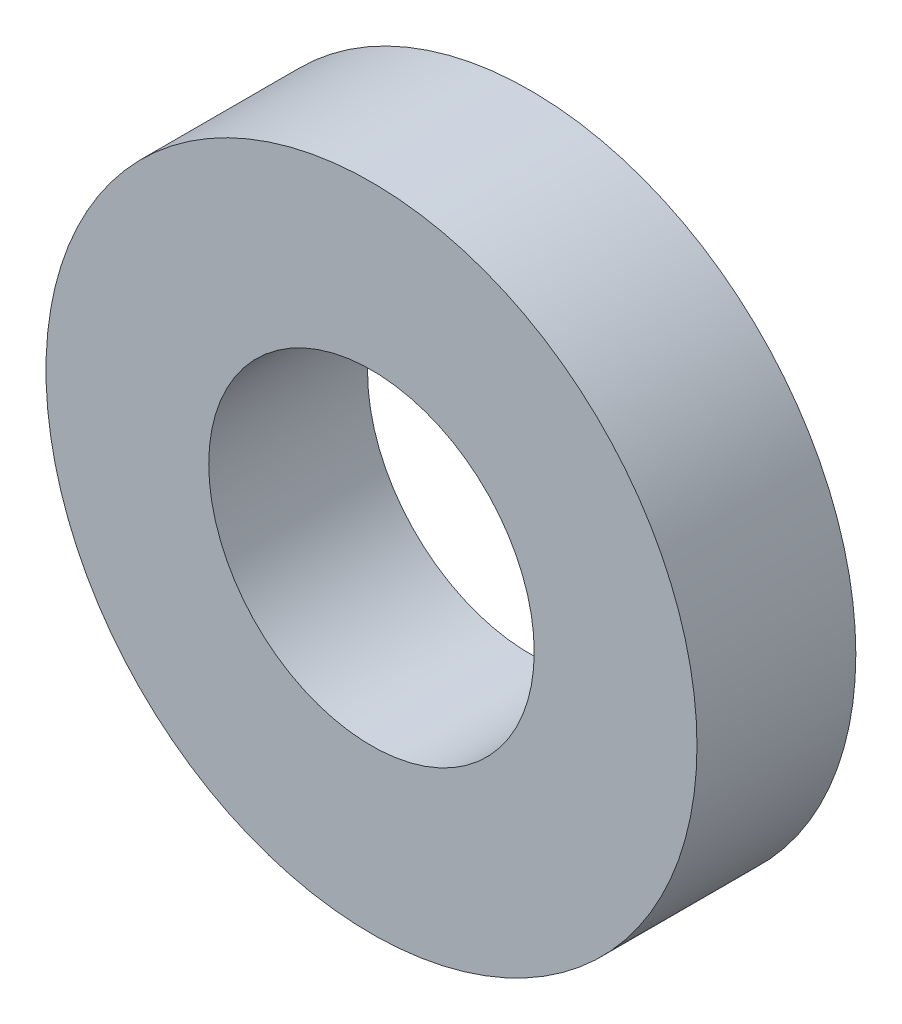
ISO-10303-21;
HEADER;
FILE_DESCRIPTION(('STEP AP214'),'2;1');
FILE_NAME('part.step','',(''),(''),'','','');
FILE_SCHEMA(('AUTOMOTIVE_DESIGN { 1 0 10303 214 1 1 1 1 }'));
ENDSEC;
DATA;
#1=APPLICATION_CONTEXT('core data for automotive mechanical design processes');
#2=APPLICATION_PROTOCOL_DEFINITION('international standard','automotive_design',2000,#1);
#3=PRODUCT_CONTEXT('',#1,'mechanical');
#4=PRODUCT('Part','Part','',(#3));
#5=PRODUCT_RELATED_PRODUCT_CATEGORY('part','',(#4));
#6=PRODUCT_DEFINITION_FORMATION('','',#4);
#7=PRODUCT_DEFINITION_CONTEXT('part definition',#1,'design');
#8=PRODUCT_DEFINITION('design','',#6,#7);
#9=PRODUCT_DEFINITION_SHAPE('','',#8);
#10=(LENGTH_UNIT() NAMED_UNIT(*) SI_UNIT(.MILLI.,.METRE.));
#11=(NAMED_UNIT(*) PLANE_ANGLE_UNIT() SI_UNIT($,.RADIAN.));
#12=(NAMED_UNIT(*) SI_UNIT($,.STERADIAN.) SOLID_ANGLE_UNIT());
#13=UNCERTAINTY_MEASURE_WITH_UNIT(LENGTH_MEASURE(1.E-05),#10,'distance_accuracy_value','');
#14=(GEOMETRIC_REPRESENTATION_CONTEXT(3) GLOBAL_UNCERTAINTY_ASSIGNED_CONTEXT((#13)) GLOBAL_UNIT_ASSIGNED_CONTEXT((#10,
#11,#12)) REPRESENTATION_CONTEXT('',''));
#15=CARTESIAN_POINT('',(0.,0.,0.));
#16=DIRECTION('',(0.,0.,1.));
#17=DIRECTION('',(1.,0.,0.));
#18=AXIS2_PLACEMENT_3D('',#15,#16,#17);
#19=CARTESIAN_POINT('',(0.,0.,3.0988));
#20=DIRECTION('',(0.,0.,1.));
#21=DIRECTION('',(1.,0.,0.));
#22=AXIS2_PLACEMENT_3D('',#19,#20,#21);
#23=PLANE('',#22);
#24=CARTESIAN_POINT('',(0.,0.,3.0988));
#25=DIRECTION('',(0.,0.,1.));
#26=DIRECTION('',(1.,0.,0.));
#27=AXIS2_PLACEMENT_3D('',#24,#25,#26);
#28=CIRCLE('',#27,6.35);
#29=CARTESIAN_POINT('',(6.35,0.,3.0988));
#30=VERTEX_POINT('',#29);
#31=EDGE_CURVE('E10',#30,#30,#28,.T.);
#32=ORIENTED_EDGE('',*,*,#31,.T.);
#33=EDGE_LOOP('',(#32));
#34=FACE_BOUND('',#33,.T.);
#35=CARTESIAN_POINT('',(0.,0.,3.0988));
#36=DIRECTION('',(0.,0.,1.));
#37=DIRECTION('',(1.,0.,0.));
#38=AXIS2_PLACEMENT_3D('',#35,#36,#37);
#39=CIRCLE('',#38,3.175);
#40=CARTESIAN_POINT('',(3.175,0.,3.0988));
#41=VERTEX_POINT('',#40);
#42=EDGE_CURVE('E44',#41,#41,#39,.T.);
#43=ORIENTED_EDGE('',*,*,#42,.F.);
#44=EDGE_LOOP('',(#43));
#45=FACE_BOUND('',#44,.T.);
#46=ADVANCED_FACE('F33',(#34,#45),#23,.T.);
#47=CARTESIAN_POINT('',(0.,0.,0.));
#48=DIRECTION('',(0.,0.,1.));
#49=DIRECTION('',(1.,0.,0.));
#50=AXIS2_PLACEMENT_3D('',#47,#48,#49);
#51=PLANE('',#50);
#52=CARTESIAN_POINT('',(0.,0.,0.));
#53=DIRECTION('',(0.,0.,1.));
#54=DIRECTION('',(1.,0.,0.));
#55=AXIS2_PLACEMENT_3D('',#52,#53,#54);
#56=CIRCLE('',#55,6.35);
#57=CARTESIAN_POINT('',(6.35,0.,0.));
#58=VERTEX_POINT('',#57);
#59=EDGE_CURVE('E37',#58,#58,#56,.T.);
#60=ORIENTED_EDGE('',*,*,#59,.F.);
#61=EDGE_LOOP('',(#60));
#62=FACE_BOUND('',#61,.T.);
#63=CARTESIAN_POINT('',(0.,0.,0.));
#64=DIRECTION('',(0.,0.,1.));
#65=DIRECTION('',(1.,0.,0.));
#66=AXIS2_PLACEMENT_3D('',#63,#64,#65);
#67=CIRCLE('',#66,3.175);
#68=CARTESIAN_POINT('',(3.175,0.,0.));
#69=VERTEX_POINT('',#68);
#70=EDGE_CURVE('E46',#69,#69,#67,.T.);
#71=ORIENTED_EDGE('',*,*,#70,.T.);
#72=EDGE_LOOP('',(#71));
#73=FACE_BOUND('',#72,.T.);
#74=ADVANCED_FACE('F56',(#62,#73),#51,.F.);
#75=CARTESIAN_POINT('',(0.,0.,3.0988));
#76=DIRECTION('',(0.,0.,-1.));
#77=DIRECTION('',(-1.,0.,0.));
#78=AXIS2_PLACEMENT_3D('',#75,#76,#77);
#79=CYLINDRICAL_SURFACE('',#78,6.35);
#80=ORIENTED_EDGE('',*,*,#31,.F.);
#81=EDGE_LOOP('',(#80));
#82=FACE_BOUND('',#81,.T.);
#83=ORIENTED_EDGE('',*,*,#59,.T.);
#84=EDGE_LOOP('',(#83));
#85=FACE_BOUND('',#84,.T.);
#86=ADVANCED_FACE('F35',(#82,#85),#79,.T.);
#87=CARTESIAN_POINT('',(0.,0.,3.0988));
#88=DIRECTION('',(0.,0.,-1.));
#89=DIRECTION('',(-1.,0.,0.));
#90=AXIS2_PLACEMENT_3D('',#87,#88,#89);
#91=CYLINDRICAL_SURFACE('',#90,3.175);
#92=ORIENTED_EDGE('',*,*,#42,.T.);
#93=EDGE_LOOP('',(#92));
#94=FACE_BOUND('',#93,.T.);
#95=ORIENTED_EDGE('',*,*,#70,.F.);
#96=EDGE_LOOP('',(#95));
#97=FACE_BOUND('',#96,.T.);
#98=ADVANCED_FACE('F52',(#94,#97),#91,.F.);
#99=CLOSED_SHELL('',(#46,#74,#86,#98));
#100=MANIFOLD_SOLID_BREP('B2',#99);
#101=ADVANCED_BREP_SHAPE_REPRESENTATION('',(#18,#100),#14);
#102=SHAPE_DEFINITION_REPRESENTATION(#9,#101);
ENDSEC;
END-ISO-10303-21;
